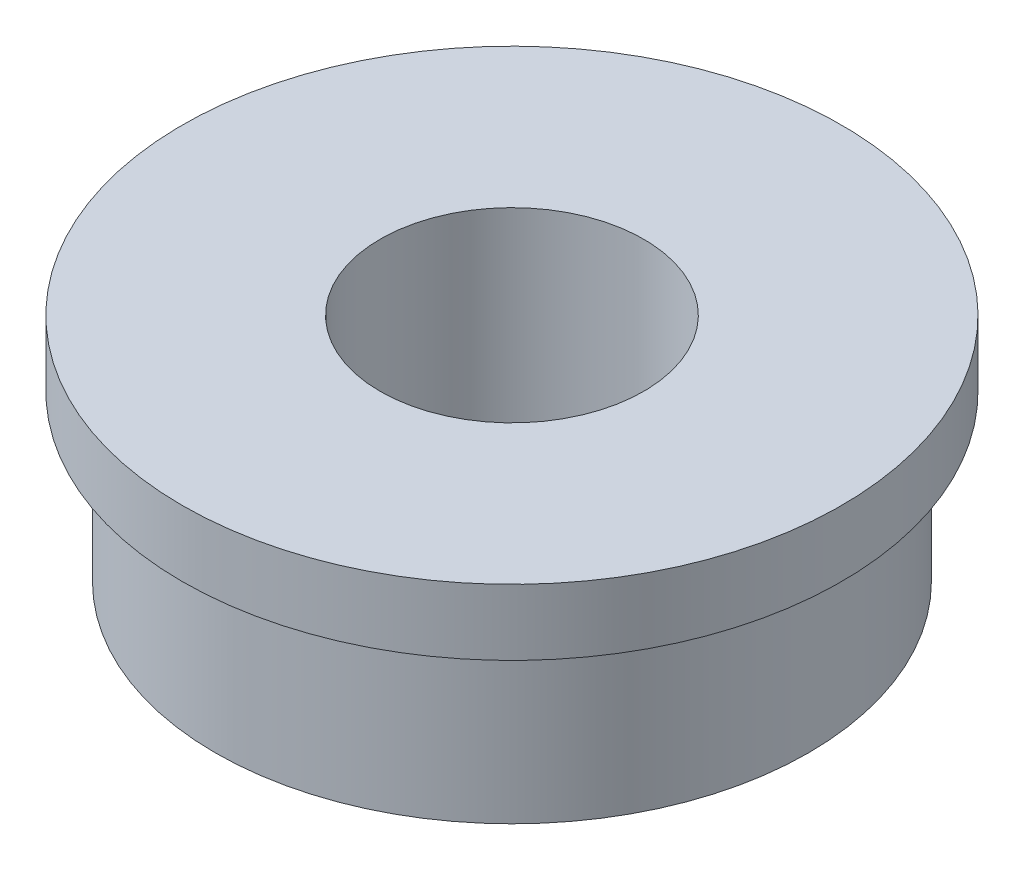
ISO-10303-21;
HEADER;
FILE_DESCRIPTION(('STEP AP214'),'2;1');
FILE_NAME('part.step','',(''),(''),'','','');
FILE_SCHEMA(('AUTOMOTIVE_DESIGN { 1 0 10303 214 1 1 1 1 }'));
ENDSEC;
DATA;
#1=APPLICATION_CONTEXT('core data for automotive mechanical design processes');
#2=APPLICATION_PROTOCOL_DEFINITION('international standard','automotive_design',2000,#1);
#3=PRODUCT_CONTEXT('',#1,'mechanical');
#4=PRODUCT('Part','Part','',(#3));
#5=PRODUCT_RELATED_PRODUCT_CATEGORY('part','',(#4));
#6=PRODUCT_DEFINITION_FORMATION('','',#4);
#7=PRODUCT_DEFINITION_CONTEXT('part definition',#1,'design');
#8=PRODUCT_DEFINITION('design','',#6,#7);
#9=PRODUCT_DEFINITION_SHAPE('','',#8);
#10=(LENGTH_UNIT() NAMED_UNIT(*) SI_UNIT(.MILLI.,.METRE.));
#11=(NAMED_UNIT(*) PLANE_ANGLE_UNIT() SI_UNIT($,.RADIAN.));
#12=(NAMED_UNIT(*) SI_UNIT($,.STERADIAN.) SOLID_ANGLE_UNIT());
#13=UNCERTAINTY_MEASURE_WITH_UNIT(LENGTH_MEASURE(1.E-05),#10,'distance_accuracy_value','');
#14=(GEOMETRIC_REPRESENTATION_CONTEXT(3) GLOBAL_UNCERTAINTY_ASSIGNED_CONTEXT((#13)) GLOBAL_UNIT_ASSIGNED_CONTEXT((#10,
#11,#12)) REPRESENTATION_CONTEXT('',''));
#15=CARTESIAN_POINT('',(0.,0.,0.));
#16=DIRECTION('',(0.,0.,1.));
#17=DIRECTION('',(1.,0.,0.));
#18=AXIS2_PLACEMENT_3D('',#15,#16,#17);
#19=CARTESIAN_POINT('',(0.,11.1125,0.));
#20=DIRECTION('',(0.,-1.,0.));
#21=DIRECTION('',(0.,0.,-1.));
#22=AXIS2_PLACEMENT_3D('',#19,#20,#21);
#23=CYLINDRICAL_SURFACE('',#22,14.2875);
#24=CARTESIAN_POINT('',(0.,0.,0.));
#25=DIRECTION('',(0.,1.,0.));
#26=DIRECTION('',(0.,0.,1.));
#27=AXIS2_PLACEMENT_3D('',#24,#25,#26);
#28=CIRCLE('',#27,14.2875);
#29=CARTESIAN_POINT('',(0.,0.,14.2875));
#30=VERTEX_POINT('',#29);
#31=EDGE_CURVE('E36',#30,#30,#28,.T.);
#32=ORIENTED_EDGE('',*,*,#31,.T.);
#33=EDGE_LOOP('',(#32));
#34=FACE_BOUND('',#33,.T.);
#35=CARTESIAN_POINT('',(0.,7.9375,0.));
#36=DIRECTION('',(0.,1.,0.));
#37=DIRECTION('',(0.,0.,1.));
#38=AXIS2_PLACEMENT_3D('',#35,#36,#37);
#39=CIRCLE('',#38,14.2875);
#40=CARTESIAN_POINT('',(0.,7.9375,14.2875));
#41=VERTEX_POINT('',#40);
#42=EDGE_CURVE('E10',#41,#41,#39,.T.);
#43=ORIENTED_EDGE('',*,*,#42,.F.);
#44=EDGE_LOOP('',(#43));
#45=FACE_BOUND('',#44,.T.);
#46=ADVANCED_FACE('F30',(#34,#45),#23,.T.);
#47=CARTESIAN_POINT('',(0.,0.,0.));
#48=DIRECTION('',(0.,1.,0.));
#49=DIRECTION('',(0.,0.,1.));
#50=AXIS2_PLACEMENT_3D('',#47,#48,#49);
#51=PLANE('',#50);
#52=CARTESIAN_POINT('',(0.,0.,0.));
#53=DIRECTION('',(0.,1.,0.));
#54=DIRECTION('',(0.,0.,1.));
#55=AXIS2_PLACEMENT_3D('',#52,#53,#54);
#56=CIRCLE('',#55,6.35);
#57=CARTESIAN_POINT('',(0.,0.,6.35));
#58=VERTEX_POINT('',#57);
#59=EDGE_CURVE('E48',#58,#58,#56,.T.);
#60=ORIENTED_EDGE('',*,*,#59,.T.);
#61=EDGE_LOOP('',(#60));
#62=FACE_BOUND('',#61,.T.);
#63=ORIENTED_EDGE('',*,*,#31,.F.);
#64=EDGE_LOOP('',(#63));
#65=FACE_BOUND('',#64,.T.);
#66=ADVANCED_FACE('F56',(#62,#65),#51,.F.);
#67=CARTESIAN_POINT('',(0.,7.9375,0.));
#68=DIRECTION('',(0.,1.,0.));
#69=DIRECTION('',(0.,0.,1.));
#70=AXIS2_PLACEMENT_3D('',#67,#68,#69);
#71=CYLINDRICAL_SURFACE('',#70,15.875);
#72=CARTESIAN_POINT('',(0.,7.9375,0.));
#73=DIRECTION('',(0.,1.,0.));
#74=DIRECTION('',(0.,0.,1.));
#75=AXIS2_PLACEMENT_3D('',#72,#73,#74);
#76=CIRCLE('',#75,15.875);
#77=CARTESIAN_POINT('',(0.,7.9375,15.875));
#78=VERTEX_POINT('',#77);
#79=EDGE_CURVE('E40',#78,#78,#76,.T.);
#80=ORIENTED_EDGE('',*,*,#79,.T.);
#81=EDGE_LOOP('',(#80));
#82=FACE_BOUND('',#81,.T.);
#83=CARTESIAN_POINT('',(0.,11.1125,0.));
#84=DIRECTION('',(0.,1.,0.));
#85=DIRECTION('',(0.,0.,1.));
#86=AXIS2_PLACEMENT_3D('',#83,#84,#85);
#87=CIRCLE('',#86,15.875);
#88=CARTESIAN_POINT('',(0.,11.1125,15.875));
#89=VERTEX_POINT('',#88);
#90=EDGE_CURVE('E44',#89,#89,#87,.T.);
#91=ORIENTED_EDGE('',*,*,#90,.F.);
#92=EDGE_LOOP('',(#91));
#93=FACE_BOUND('',#92,.T.);
#94=ADVANCED_FACE('F72',(#82,#93),#71,.T.);
#95=CARTESIAN_POINT('',(0.,7.9375,0.));
#96=DIRECTION('',(0.,1.,0.));
#97=DIRECTION('',(0.,0.,1.));
#98=AXIS2_PLACEMENT_3D('',#95,#96,#97);
#99=PLANE('',#98);
#100=ORIENTED_EDGE('',*,*,#42,.T.);
#101=EDGE_LOOP('',(#100));
#102=FACE_BOUND('',#101,.T.);
#103=ORIENTED_EDGE('',*,*,#79,.F.);
#104=EDGE_LOOP('',(#103));
#105=FACE_BOUND('',#104,.T.);
#106=ADVANCED_FACE('F68',(#102,#105),#99,.F.);
#107=CARTESIAN_POINT('',(0.,11.1125,0.));
#108=DIRECTION('',(0.,1.,0.));
#109=DIRECTION('',(0.,0.,1.));
#110=AXIS2_PLACEMENT_3D('',#107,#108,#109);
#111=PLANE('',#110);
#112=CARTESIAN_POINT('',(0.,11.1125,0.));
#113=DIRECTION('',(0.,1.,0.));
#114=DIRECTION('',(0.,0.,1.));
#115=AXIS2_PLACEMENT_3D('',#112,#113,#114);
#116=CIRCLE('',#115,6.35);
#117=CARTESIAN_POINT('',(0.,11.1125,6.35));
#118=VERTEX_POINT('',#117);
#119=EDGE_CURVE('E50',#118,#118,#116,.T.);
#120=ORIENTED_EDGE('',*,*,#119,.F.);
#121=EDGE_LOOP('',(#120));
#122=FACE_BOUND('',#121,.T.);
#123=ORIENTED_EDGE('',*,*,#90,.T.);
#124=EDGE_LOOP('',(#123));
#125=FACE_BOUND('',#124,.T.);
#126=ADVANCED_FACE('F62',(#122,#125),#111,.T.);
#127=CARTESIAN_POINT('',(0.,0.,0.));
#128=DIRECTION('',(0.,1.,0.));
#129=DIRECTION('',(0.,0.,1.));
#130=AXIS2_PLACEMENT_3D('',#127,#128,#129);
#131=CYLINDRICAL_SURFACE('',#130,6.35);
#132=ORIENTED_EDGE('',*,*,#59,.F.);
#133=EDGE_LOOP('',(#132));
#134=FACE_BOUND('',#133,.T.);
#135=ORIENTED_EDGE('',*,*,#119,.T.);
#136=EDGE_LOOP('',(#135));
#137=FACE_BOUND('',#136,.T.);
#138=ADVANCED_FACE('F59',(#134,#137),#131,.F.);
#139=CLOSED_SHELL('',(#46,#66,#94,#106,#126,#138));
#140=MANIFOLD_SOLID_BREP('B2',#139);
#141=ADVANCED_BREP_SHAPE_REPRESENTATION('',(#18,#140),#14);
#142=SHAPE_DEFINITION_REPRESENTATION(#9,#141);
ENDSEC;
END-ISO-10303-21;
